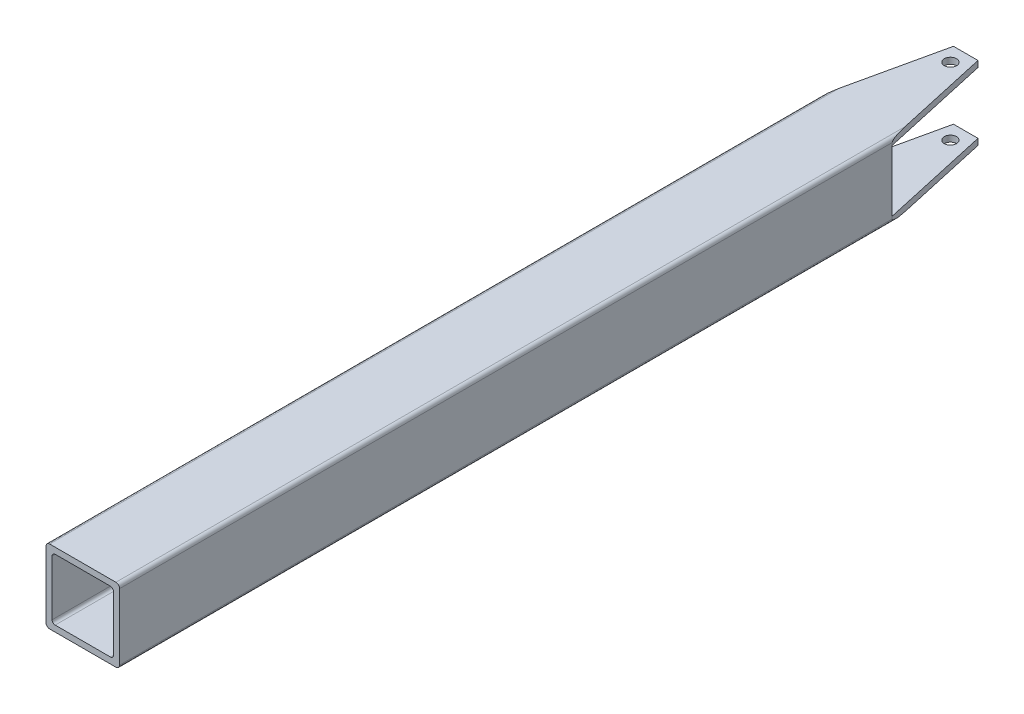
ISO-10303-21;
HEADER;
FILE_DESCRIPTION(('STEP AP214'),'2;1');
FILE_NAME('part.step','',(''),(''),'','','');
FILE_SCHEMA(('AUTOMOTIVE_DESIGN { 1 0 10303 214 1 1 1 1 }'));
ENDSEC;
DATA;
#1=APPLICATION_CONTEXT('core data for automotive mechanical design processes');
#2=APPLICATION_PROTOCOL_DEFINITION('international standard','automotive_design',2000,#1);
#3=PRODUCT_CONTEXT('',#1,'mechanical');
#4=PRODUCT('Part','Part','',(#3));
#5=PRODUCT_RELATED_PRODUCT_CATEGORY('part','',(#4));
#6=PRODUCT_DEFINITION_FORMATION('','',#4);
#7=PRODUCT_DEFINITION_CONTEXT('part definition',#1,'design');
#8=PRODUCT_DEFINITION('design','',#6,#7);
#9=PRODUCT_DEFINITION_SHAPE('','',#8);
#10=(LENGTH_UNIT() NAMED_UNIT(*) SI_UNIT(.MILLI.,.METRE.));
#11=(NAMED_UNIT(*) PLANE_ANGLE_UNIT() SI_UNIT($,.RADIAN.));
#12=(NAMED_UNIT(*) SI_UNIT($,.STERADIAN.) SOLID_ANGLE_UNIT());
#13=UNCERTAINTY_MEASURE_WITH_UNIT(LENGTH_MEASURE(1.E-05),#10,'distance_accuracy_value','');
#14=(GEOMETRIC_REPRESENTATION_CONTEXT(3) GLOBAL_UNCERTAINTY_ASSIGNED_CONTEXT((#13)) GLOBAL_UNIT_ASSIGNED_CONTEXT((#10,
#11,#12)) REPRESENTATION_CONTEXT('',''));
#15=CARTESIAN_POINT('',(0.,0.,0.));
#16=DIRECTION('',(0.,0.,1.));
#17=DIRECTION('',(1.,0.,0.));
#18=AXIS2_PLACEMENT_3D('',#15,#16,#17);
#19=CARTESIAN_POINT('',(34.29,-34.29,-457.2));
#20=DIRECTION('',(0.,0.,1.));
#21=DIRECTION('',(1.,0.,0.));
#22=AXIS2_PLACEMENT_3D('',#19,#20,#21);
#23=PLANE('',#22);
#24=DIRECTION('',(-1.,0.,0.));
#25=VECTOR('',#24,1.);
#26=CARTESIAN_POINT('',(28.575,31.75,-457.2));
#27=LINE('',#26,#25);
#28=CARTESIAN_POINT('',(12.7,31.75,-457.2));
#29=VERTEX_POINT('',#28);
#30=CARTESIAN_POINT('',(-12.7,31.75,-457.2));
#31=VERTEX_POINT('',#30);
#32=EDGE_CURVE('E234',#29,#31,#27,.T.);
#33=ORIENTED_EDGE('',*,*,#32,.T.);
#34=DIRECTION('',(0.,-1.,0.));
#35=VECTOR('',#34,1.);
#36=CARTESIAN_POINT('',(-12.7,38.1,-457.2));
#37=LINE('',#36,#35);
#38=CARTESIAN_POINT('',(-12.7,38.1,-457.2));
#39=VERTEX_POINT('',#38);
#40=EDGE_CURVE('E60',#39,#31,#37,.T.);
#41=ORIENTED_EDGE('',*,*,#40,.F.);
#42=DIRECTION('',(-1.,0.,0.));
#43=VECTOR('',#42,1.);
#44=CARTESIAN_POINT('',(34.29,38.1,-457.2));
#45=LINE('',#44,#43);
#46=CARTESIAN_POINT('',(12.7,38.1,-457.2));
#47=VERTEX_POINT('',#46);
#48=EDGE_CURVE('E232',#47,#39,#45,.T.);
#49=ORIENTED_EDGE('',*,*,#48,.F.);
#50=DIRECTION('',(0.,-1.,0.));
#51=VECTOR('',#50,1.);
#52=CARTESIAN_POINT('',(12.7,38.1,-457.2));
#53=LINE('',#52,#51);
#54=EDGE_CURVE('E405',#47,#29,#53,.T.);
#55=ORIENTED_EDGE('',*,*,#54,.T.);
#56=EDGE_LOOP('',(#33,#41,#49,#55));
#57=FACE_BOUND('',#56,.T.);
#58=ADVANCED_FACE('F40',(#57),#23,.F.);
#59=CARTESIAN_POINT('',(34.29,-34.29,457.2));
#60=DIRECTION('',(0.,0.,1.));
#61=DIRECTION('',(1.,0.,0.));
#62=AXIS2_PLACEMENT_3D('',#59,#60,#61);
#63=PLANE('',#62);
#64=CARTESIAN_POINT('',(34.29,-34.29,457.2));
#65=DIRECTION('',(0.,0.,1.));
#66=DIRECTION('',(1.,0.,0.));
#67=AXIS2_PLACEMENT_3D('',#64,#65,#66);
#68=CIRCLE('',#67,3.81000000000001);
#69=CARTESIAN_POINT('',(34.29,-38.1,457.2));
#70=VERTEX_POINT('',#69);
#71=CARTESIAN_POINT('',(38.1,-34.29,457.2));
#72=VERTEX_POINT('',#71);
#73=EDGE_CURVE('E306',#70,#72,#68,.T.);
#74=ORIENTED_EDGE('',*,*,#73,.T.);
#75=DIRECTION('',(0.,1.,0.));
#76=VECTOR('',#75,1.);
#77=CARTESIAN_POINT('',(38.1,-34.29,457.2));
#78=LINE('',#77,#76);
#79=CARTESIAN_POINT('',(38.1,34.29,457.2));
#80=VERTEX_POINT('',#79);
#81=EDGE_CURVE('E309',#72,#80,#78,.T.);
#82=ORIENTED_EDGE('',*,*,#81,.T.);
#83=CARTESIAN_POINT('',(34.29,34.29,457.2));
#84=DIRECTION('',(0.,0.,1.));
#85=DIRECTION('',(1.,0.,0.));
#86=AXIS2_PLACEMENT_3D('',#83,#84,#85);
#87=CIRCLE('',#86,3.81000000000001);
#88=CARTESIAN_POINT('',(34.29,38.1,457.2));
#89=VERTEX_POINT('',#88);
#90=EDGE_CURVE('E311',#80,#89,#87,.T.);
#91=ORIENTED_EDGE('',*,*,#90,.T.);
#92=DIRECTION('',(-1.,0.,0.));
#93=VECTOR('',#92,1.);
#94=CARTESIAN_POINT('',(34.29,38.1,457.2));
#95=LINE('',#94,#93);
#96=CARTESIAN_POINT('',(-34.29,38.1,457.2));
#97=VERTEX_POINT('',#96);
#98=EDGE_CURVE('E313',#89,#97,#95,.T.);
#99=ORIENTED_EDGE('',*,*,#98,.T.);
#100=CARTESIAN_POINT('',(-34.29,34.29,457.2));
#101=DIRECTION('',(0.,0.,1.));
#102=DIRECTION('',(1.,0.,0.));
#103=AXIS2_PLACEMENT_3D('',#100,#101,#102);
#104=CIRCLE('',#103,3.80999999999999);
#105=CARTESIAN_POINT('',(-38.1,34.29,457.2));
#106=VERTEX_POINT('',#105);
#107=EDGE_CURVE('E315',#97,#106,#104,.T.);
#108=ORIENTED_EDGE('',*,*,#107,.T.);
#109=DIRECTION('',(0.,-1.,0.));
#110=VECTOR('',#109,1.);
#111=CARTESIAN_POINT('',(-38.1,-34.29,457.2));
#112=LINE('',#111,#110);
#113=CARTESIAN_POINT('',(-38.1,-34.29,457.2));
#114=VERTEX_POINT('',#113);
#115=EDGE_CURVE('E317',#106,#114,#112,.T.);
#116=ORIENTED_EDGE('',*,*,#115,.T.);
#117=CARTESIAN_POINT('',(-34.29,-34.29,457.2));
#118=DIRECTION('',(0.,0.,1.));
#119=DIRECTION('',(1.,0.,0.));
#120=AXIS2_PLACEMENT_3D('',#117,#118,#119);
#121=CIRCLE('',#120,3.80999999999999);
#122=CARTESIAN_POINT('',(-34.29,-38.1,457.2));
#123=VERTEX_POINT('',#122);
#124=EDGE_CURVE('E319',#114,#123,#121,.T.);
#125=ORIENTED_EDGE('',*,*,#124,.T.);
#126=DIRECTION('',(1.,0.,0.));
#127=VECTOR('',#126,1.);
#128=CARTESIAN_POINT('',(34.29,-38.1,457.2));
#129=LINE('',#128,#127);
#130=EDGE_CURVE('E321',#123,#70,#129,.T.);
#131=ORIENTED_EDGE('',*,*,#130,.T.);
#132=EDGE_LOOP('',(#74,#82,#91,#99,#108,#116,#125,#131));
#133=FACE_BOUND('',#132,.T.);
#134=DIRECTION('',(-1.,0.,0.));
#135=VECTOR('',#134,1.);
#136=CARTESIAN_POINT('',(28.575,31.75,457.2));
#137=LINE('',#136,#135);
#138=CARTESIAN_POINT('',(28.575,31.75,457.2));
#139=VERTEX_POINT('',#138);
#140=CARTESIAN_POINT('',(-28.575,31.75,457.2));
#141=VERTEX_POINT('',#140);
#142=EDGE_CURVE('E259',#139,#141,#137,.T.);
#143=ORIENTED_EDGE('',*,*,#142,.F.);
#144=CARTESIAN_POINT('',(28.575,28.575,457.2));
#145=DIRECTION('',(0.,0.,1.));
#146=DIRECTION('',(1.,0.,0.));
#147=AXIS2_PLACEMENT_3D('',#144,#145,#146);
#148=CIRCLE('',#147,3.17499999999999);
#149=CARTESIAN_POINT('',(31.75,28.575,457.2));
#150=VERTEX_POINT('',#149);
#151=EDGE_CURVE('E251',#150,#139,#148,.T.);
#152=ORIENTED_EDGE('',*,*,#151,.F.);
#153=DIRECTION('',(0.,1.,0.));
#154=VECTOR('',#153,1.);
#155=CARTESIAN_POINT('',(31.75,28.575,457.2));
#156=LINE('',#155,#154);
#157=CARTESIAN_POINT('',(31.75,-28.575,457.2));
#158=VERTEX_POINT('',#157);
#159=EDGE_CURVE('E272',#158,#150,#156,.T.);
#160=ORIENTED_EDGE('',*,*,#159,.F.);
#161=CARTESIAN_POINT('',(28.575,-28.575,457.2));
#162=DIRECTION('',(0.,0.,1.));
#163=DIRECTION('',(1.,0.,0.));
#164=AXIS2_PLACEMENT_3D('',#161,#162,#163);
#165=CIRCLE('',#164,3.175);
#166=CARTESIAN_POINT('',(28.575,-31.75,457.2));
#167=VERTEX_POINT('',#166);
#168=EDGE_CURVE('E269',#167,#158,#165,.T.);
#169=ORIENTED_EDGE('',*,*,#168,.F.);
#170=DIRECTION('',(1.,0.,0.));
#171=VECTOR('',#170,1.);
#172=CARTESIAN_POINT('',(28.575,-31.75,457.2));
#173=LINE('',#172,#171);
#174=CARTESIAN_POINT('',(-28.575,-31.75,457.2));
#175=VERTEX_POINT('',#174);
#176=EDGE_CURVE('E267',#175,#167,#173,.T.);
#177=ORIENTED_EDGE('',*,*,#176,.F.);
#178=CARTESIAN_POINT('',(-28.575,-28.575,457.2));
#179=DIRECTION('',(0.,0.,1.));
#180=DIRECTION('',(1.,0.,0.));
#181=AXIS2_PLACEMENT_3D('',#178,#179,#180);
#182=CIRCLE('',#181,3.175);
#183=CARTESIAN_POINT('',(-31.75,-28.575,457.2));
#184=VERTEX_POINT('',#183);
#185=EDGE_CURVE('E265',#184,#175,#182,.T.);
#186=ORIENTED_EDGE('',*,*,#185,.F.);
#187=DIRECTION('',(0.,-1.,0.));
#188=VECTOR('',#187,1.);
#189=CARTESIAN_POINT('',(-31.75,28.575,457.2));
#190=LINE('',#189,#188);
#191=CARTESIAN_POINT('',(-31.75,28.575,457.2));
#192=VERTEX_POINT('',#191);
#193=EDGE_CURVE('E263',#192,#184,#190,.T.);
#194=ORIENTED_EDGE('',*,*,#193,.F.);
#195=CARTESIAN_POINT('',(-28.575,28.575,457.2));
#196=DIRECTION('',(0.,0.,1.));
#197=DIRECTION('',(1.,0.,0.));
#198=AXIS2_PLACEMENT_3D('',#195,#196,#197);
#199=CIRCLE('',#198,3.175);
#200=EDGE_CURVE('E261',#141,#192,#199,.T.);
#201=ORIENTED_EDGE('',*,*,#200,.F.);
#202=EDGE_LOOP('',(#143,#152,#160,#169,#177,#186,#194,#201));
#203=FACE_BOUND('',#202,.T.);
#204=ADVANCED_FACE('F471',(#133,#203),#63,.T.);
#205=CARTESIAN_POINT('',(34.29,-34.29,457.2));
#206=DIRECTION('',(0.,0.,-1.));
#207=DIRECTION('',(-1.,0.,0.));
#208=AXIS2_PLACEMENT_3D('',#205,#206,#207);
#209=CYLINDRICAL_SURFACE('',#208,3.81000000000001);
#210=DIRECTION('',(0.,0.,-1.));
#211=VECTOR('',#210,1.);
#212=CARTESIAN_POINT('',(34.29,-38.1,457.2));
#213=LINE('',#212,#211);
#214=CARTESIAN_POINT('',(34.29,-38.1,-360.045));
#215=VERTEX_POINT('',#214);
#216=EDGE_CURVE('E323',#70,#215,#213,.T.);
#217=ORIENTED_EDGE('',*,*,#216,.T.);
#218=CARTESIAN_POINT('',(34.29,-34.29,-360.045));
#219=DIRECTION('',(-0.976187060183953,0.,0.216930457818656));
#220=DIRECTION('',(-0.216930457818656,0.,-0.976187060183953));
#221=AXIS2_PLACEMENT_3D('',#218,#219,#220);
#222=ELLIPSE('',#221,17.563232191143,3.81000000000001);
#223=CARTESIAN_POINT('',(38.1,-34.29,-342.9));
#224=VERTEX_POINT('',#223);
#225=EDGE_CURVE('E362',#215,#224,#222,.T.);
#226=ORIENTED_EDGE('',*,*,#225,.T.);
#227=DIRECTION('',(0.,0.,-1.));
#228=VECTOR('',#227,1.);
#229=CARTESIAN_POINT('',(38.1,-34.29,457.2));
#230=LINE('',#229,#228);
#231=EDGE_CURVE('E50',#72,#224,#230,.T.);
#232=ORIENTED_EDGE('',*,*,#231,.F.);
#233=ORIENTED_EDGE('',*,*,#73,.F.);
#234=EDGE_LOOP('',(#217,#226,#232,#233));
#235=FACE_BOUND('',#234,.T.);
#236=ADVANCED_FACE('F42',(#235),#209,.T.);
#237=CARTESIAN_POINT('',(38.1,-34.29,457.2));
#238=DIRECTION('',(-1.,0.,0.));
#239=DIRECTION('',(0.,0.,1.));
#240=AXIS2_PLACEMENT_3D('',#237,#238,#239);
#241=PLANE('',#240);
#242=ORIENTED_EDGE('',*,*,#231,.T.);
#243=DIRECTION('',(0.,-1.,0.));
#244=VECTOR('',#243,1.);
#245=CARTESIAN_POINT('',(38.1,38.1,-342.9));
#246=LINE('',#245,#244);
#247=CARTESIAN_POINT('',(38.1,-31.75,-342.9));
#248=VERTEX_POINT('',#247);
#249=EDGE_CURVE('E356',#248,#224,#246,.T.);
#250=ORIENTED_EDGE('',*,*,#249,.F.);
#251=DIRECTION('',(0.,1.,0.));
#252=VECTOR('',#251,1.);
#253=CARTESIAN_POINT('',(38.1,31.75,-342.9));
#254=LINE('',#253,#252);
#255=CARTESIAN_POINT('',(38.1,31.75,-342.9));
#256=VERTEX_POINT('',#255);
#257=EDGE_CURVE('E372',#248,#256,#254,.T.);
#258=ORIENTED_EDGE('',*,*,#257,.T.);
#259=CARTESIAN_POINT('',(38.1,34.29,-342.9));
#260=VERTEX_POINT('',#259);
#261=EDGE_CURVE('E418',#260,#256,#246,.T.);
#262=ORIENTED_EDGE('',*,*,#261,.F.);
#263=DIRECTION('',(0.,0.,-1.));
#264=VECTOR('',#263,1.);
#265=CARTESIAN_POINT('',(38.1,34.29,457.2));
#266=LINE('',#265,#264);
#267=EDGE_CURVE('E345',#80,#260,#266,.T.);
#268=ORIENTED_EDGE('',*,*,#267,.F.);
#269=ORIENTED_EDGE('',*,*,#81,.F.);
#270=EDGE_LOOP('',(#242,#250,#258,#262,#268,#269));
#271=FACE_BOUND('',#270,.T.);
#272=ADVANCED_FACE('F354',(#271),#241,.F.);
#273=CARTESIAN_POINT('',(34.29,34.29,457.2));
#274=DIRECTION('',(0.,0.,-1.));
#275=DIRECTION('',(-1.,0.,0.));
#276=AXIS2_PLACEMENT_3D('',#273,#274,#275);
#277=CYLINDRICAL_SURFACE('',#276,3.81000000000001);
#278=ORIENTED_EDGE('',*,*,#267,.T.);
#279=CARTESIAN_POINT('',(34.29,34.29,-360.045));
#280=DIRECTION('',(-0.976187060183953,0.,0.216930457818656));
#281=DIRECTION('',(-0.216930457818656,0.,-0.976187060183953));
#282=AXIS2_PLACEMENT_3D('',#279,#280,#281);
#283=ELLIPSE('',#282,17.563232191143,3.81000000000001);
#284=CARTESIAN_POINT('',(34.29,38.1,-360.045));
#285=VERTEX_POINT('',#284);
#286=EDGE_CURVE('E366',#260,#285,#283,.T.);
#287=ORIENTED_EDGE('',*,*,#286,.T.);
#288=DIRECTION('',(0.,0.,-1.));
#289=VECTOR('',#288,1.);
#290=CARTESIAN_POINT('',(34.29,38.1,457.2));
#291=LINE('',#290,#289);
#292=EDGE_CURVE('E342',#89,#285,#291,.T.);
#293=ORIENTED_EDGE('',*,*,#292,.F.);
#294=ORIENTED_EDGE('',*,*,#90,.F.);
#295=EDGE_LOOP('',(#278,#287,#293,#294));
#296=FACE_BOUND('',#295,.T.);
#297=ADVANCED_FACE('F475',(#296),#277,.T.);
#298=CARTESIAN_POINT('',(34.29,38.1,457.2));
#299=DIRECTION('',(0.,-1.,0.));
#300=DIRECTION('',(0.,0.,-1.));
#301=AXIS2_PLACEMENT_3D('',#298,#299,#300);
#302=PLANE('',#301);
#303=CARTESIAN_POINT('',(0.,38.1,-441.325));
#304=DIRECTION('',(0.,1.,0.));
#305=DIRECTION('',(0.,0.,1.));
#306=AXIS2_PLACEMENT_3D('',#303,#304,#305);
#307=CIRCLE('',#306,6.35);
#308=CARTESIAN_POINT('',(0.,38.1,-434.975));
#309=VERTEX_POINT('',#308);
#310=EDGE_CURVE('E409',#309,#309,#307,.T.);
#311=ORIENTED_EDGE('',*,*,#310,.F.);
#312=EDGE_LOOP('',(#311));
#313=FACE_BOUND('',#312,.T.);
#314=ORIENTED_EDGE('',*,*,#48,.T.);
#315=DIRECTION('',(-0.216930457818656,0.,0.976187060183953));
#316=VECTOR('',#315,1.);
#317=CARTESIAN_POINT('',(-12.7,38.1,-457.2));
#318=LINE('',#317,#316);
#319=CARTESIAN_POINT('',(-34.2899999999999,38.1,-360.045));
#320=VERTEX_POINT('',#319);
#321=EDGE_CURVE('E216',#39,#320,#318,.T.);
#322=ORIENTED_EDGE('',*,*,#321,.T.);
#323=DIRECTION('',(0.,0.,-1.));
#324=VECTOR('',#323,1.);
#325=CARTESIAN_POINT('',(-34.29,38.1,457.2));
#326=LINE('',#325,#324);
#327=EDGE_CURVE('E339',#97,#320,#326,.T.);
#328=ORIENTED_EDGE('',*,*,#327,.F.);
#329=ORIENTED_EDGE('',*,*,#98,.F.);
#330=ORIENTED_EDGE('',*,*,#292,.T.);
#331=DIRECTION('',(-0.216930457818656,0.,-0.976187060183953));
#332=VECTOR('',#331,1.);
#333=CARTESIAN_POINT('',(12.7,38.1,-457.2));
#334=LINE('',#333,#332);
#335=EDGE_CURVE('E242',#285,#47,#334,.T.);
#336=ORIENTED_EDGE('',*,*,#335,.T.);
#337=EDGE_LOOP('',(#314,#322,#328,#329,#330,#336));
#338=FACE_BOUND('',#337,.T.);
#339=ADVANCED_FACE('F240',(#313,#338),#302,.F.);
#340=CARTESIAN_POINT('',(-34.29,34.29,457.2));
#341=DIRECTION('',(0.,0.,-1.));
#342=DIRECTION('',(-1.,0.,0.));
#343=AXIS2_PLACEMENT_3D('',#340,#341,#342);
#344=CYLINDRICAL_SURFACE('',#343,3.80999999999999);
#345=ORIENTED_EDGE('',*,*,#327,.T.);
#346=CARTESIAN_POINT('',(-34.29,34.29,-360.045));
#347=DIRECTION('',(0.976187060183953,0.,0.216930457818656));
#348=DIRECTION('',(0.216930457818656,0.,-0.976187060183953));
#349=AXIS2_PLACEMENT_3D('',#346,#347,#348);
#350=ELLIPSE('',#349,17.5632321911429,3.80999999999999);
#351=CARTESIAN_POINT('',(-38.1,34.29,-342.9));
#352=VERTEX_POINT('',#351);
#353=EDGE_CURVE('E219',#320,#352,#350,.T.);
#354=ORIENTED_EDGE('',*,*,#353,.T.);
#355=DIRECTION('',(0.,0.,-1.));
#356=VECTOR('',#355,1.);
#357=CARTESIAN_POINT('',(-38.1,34.29,457.2));
#358=LINE('',#357,#356);
#359=EDGE_CURVE('E335',#106,#352,#358,.T.);
#360=ORIENTED_EDGE('',*,*,#359,.F.);
#361=ORIENTED_EDGE('',*,*,#107,.F.);
#362=EDGE_LOOP('',(#345,#354,#360,#361));
#363=FACE_BOUND('',#362,.T.);
#364=ADVANCED_FACE('F467',(#363),#344,.T.);
#365=CARTESIAN_POINT('',(-38.1,-34.29,457.2));
#366=DIRECTION('',(1.,0.,0.));
#367=DIRECTION('',(0.,0.,-1.));
#368=AXIS2_PLACEMENT_3D('',#365,#366,#367);
#369=PLANE('',#368);
#370=ORIENTED_EDGE('',*,*,#359,.T.);
#371=DIRECTION('',(0.,-1.,0.));
#372=VECTOR('',#371,1.);
#373=CARTESIAN_POINT('',(-38.1,38.1,-342.9));
#374=LINE('',#373,#372);
#375=CARTESIAN_POINT('',(-38.1,31.75,-342.9));
#376=VERTEX_POINT('',#375);
#377=EDGE_CURVE('E422',#352,#376,#374,.T.);
#378=ORIENTED_EDGE('',*,*,#377,.T.);
#379=DIRECTION('',(0.,1.,0.));
#380=VECTOR('',#379,1.);
#381=CARTESIAN_POINT('',(-38.1,31.75,-342.9));
#382=LINE('',#381,#380);
#383=CARTESIAN_POINT('',(-38.1,-31.75,-342.9));
#384=VERTEX_POINT('',#383);
#385=EDGE_CURVE('E365',#384,#376,#382,.T.);
#386=ORIENTED_EDGE('',*,*,#385,.F.);
#387=CARTESIAN_POINT('',(-38.1,-34.29,-342.9));
#388=VERTEX_POINT('',#387);
#389=EDGE_CURVE('E225',#384,#388,#374,.T.);
#390=ORIENTED_EDGE('',*,*,#389,.T.);
#391=DIRECTION('',(0.,0.,-1.));
#392=VECTOR('',#391,1.);
#393=CARTESIAN_POINT('',(-38.1,-34.29,457.2));
#394=LINE('',#393,#392);
#395=EDGE_CURVE('E331',#114,#388,#394,.T.);
#396=ORIENTED_EDGE('',*,*,#395,.F.);
#397=ORIENTED_EDGE('',*,*,#115,.F.);
#398=EDGE_LOOP('',(#370,#378,#386,#390,#396,#397));
#399=FACE_BOUND('',#398,.T.);
#400=ADVANCED_FACE('F462',(#399),#369,.F.);
#401=CARTESIAN_POINT('',(-34.29,-34.29,457.2));
#402=DIRECTION('',(0.,0.,-1.));
#403=DIRECTION('',(-1.,0.,0.));
#404=AXIS2_PLACEMENT_3D('',#401,#402,#403);
#405=CYLINDRICAL_SURFACE('',#404,3.80999999999999);
#406=ORIENTED_EDGE('',*,*,#395,.T.);
#407=CARTESIAN_POINT('',(-34.29,-34.29,-360.045));
#408=DIRECTION('',(0.976187060183953,0.,0.216930457818656));
#409=DIRECTION('',(0.216930457818656,0.,-0.976187060183953));
#410=AXIS2_PLACEMENT_3D('',#407,#408,#409);
#411=ELLIPSE('',#410,17.5632321911429,3.80999999999999);
#412=CARTESIAN_POINT('',(-34.2900000000001,-38.1,-360.045));
#413=VERTEX_POINT('',#412);
#414=EDGE_CURVE('E425',#388,#413,#411,.T.);
#415=ORIENTED_EDGE('',*,*,#414,.T.);
#416=DIRECTION('',(0.,0.,-1.));
#417=VECTOR('',#416,1.);
#418=CARTESIAN_POINT('',(-34.29,-38.1,457.2));
#419=LINE('',#418,#417);
#420=EDGE_CURVE('E327',#123,#413,#419,.T.);
#421=ORIENTED_EDGE('',*,*,#420,.F.);
#422=ORIENTED_EDGE('',*,*,#124,.F.);
#423=EDGE_LOOP('',(#406,#415,#421,#422));
#424=FACE_BOUND('',#423,.T.);
#425=ADVANCED_FACE('F565',(#424),#405,.T.);
#426=CARTESIAN_POINT('',(34.29,-38.1,457.2));
#427=DIRECTION('',(0.,1.,0.));
#428=DIRECTION('',(0.,0.,1.));
#429=AXIS2_PLACEMENT_3D('',#426,#427,#428);
#430=PLANE('',#429);
#431=CARTESIAN_POINT('',(0.,-38.1,-441.325));
#432=DIRECTION('',(0.,1.,0.));
#433=DIRECTION('',(0.,0.,1.));
#434=AXIS2_PLACEMENT_3D('',#431,#432,#433);
#435=CIRCLE('',#434,6.35);
#436=CARTESIAN_POINT('',(0.,-38.1,-434.975));
#437=VERTEX_POINT('',#436);
#438=EDGE_CURVE('E412',#437,#437,#435,.T.);
#439=ORIENTED_EDGE('',*,*,#438,.T.);
#440=EDGE_LOOP('',(#439));
#441=FACE_BOUND('',#440,.T.);
#442=ORIENTED_EDGE('',*,*,#420,.T.);
#443=DIRECTION('',(-0.216930457818656,0.,0.976187060183953));
#444=VECTOR('',#443,1.);
#445=CARTESIAN_POINT('',(-12.7,-38.1,-457.2));
#446=LINE('',#445,#444);
#447=CARTESIAN_POINT('',(-12.7,-38.1,-457.2));
#448=VERTEX_POINT('',#447);
#449=EDGE_CURVE('E226',#448,#413,#446,.T.);
#450=ORIENTED_EDGE('',*,*,#449,.F.);
#451=DIRECTION('',(1.,0.,0.));
#452=VECTOR('',#451,1.);
#453=CARTESIAN_POINT('',(34.29,-38.1,-457.2));
#454=LINE('',#453,#452);
#455=CARTESIAN_POINT('',(12.7,-38.1,-457.2));
#456=VERTEX_POINT('',#455);
#457=EDGE_CURVE('E244',#448,#456,#454,.T.);
#458=ORIENTED_EDGE('',*,*,#457,.T.);
#459=DIRECTION('',(-0.216930457818656,0.,-0.976187060183953));
#460=VECTOR('',#459,1.);
#461=CARTESIAN_POINT('',(12.7,-38.1,-457.2));
#462=LINE('',#461,#460);
#463=EDGE_CURVE('E69',#215,#456,#462,.T.);
#464=ORIENTED_EDGE('',*,*,#463,.F.);
#465=ORIENTED_EDGE('',*,*,#216,.F.);
#466=ORIENTED_EDGE('',*,*,#130,.F.);
#467=EDGE_LOOP('',(#442,#450,#458,#464,#465,#466));
#468=FACE_BOUND('',#467,.T.);
#469=ADVANCED_FACE('F568',(#441,#468),#430,.F.);
#470=CARTESIAN_POINT('',(28.575,28.575,457.2));
#471=DIRECTION('',(0.,0.,-1.));
#472=DIRECTION('',(-1.,0.,0.));
#473=AXIS2_PLACEMENT_3D('',#470,#471,#472);
#474=CYLINDRICAL_SURFACE('',#473,3.17499999999999);
#475=CARTESIAN_POINT('',(28.575,28.575,-342.9));
#476=DIRECTION('',(0.,0.,1.));
#477=DIRECTION('',(1.,0.,0.));
#478=AXIS2_PLACEMENT_3D('',#475,#476,#477);
#479=CIRCLE('',#478,3.17499999999999);
#480=CARTESIAN_POINT('',(31.75,28.575,-342.9));
#481=VERTEX_POINT('',#480);
#482=CARTESIAN_POINT('',(28.575,31.75,-342.9));
#483=VERTEX_POINT('',#482);
#484=EDGE_CURVE('E394',#481,#483,#479,.T.);
#485=ORIENTED_EDGE('',*,*,#484,.F.);
#486=DIRECTION('',(0.,0.,-1.));
#487=VECTOR('',#486,1.);
#488=CARTESIAN_POINT('',(31.75,28.575,457.2));
#489=LINE('',#488,#487);
#490=EDGE_CURVE('E274',#150,#481,#489,.T.);
#491=ORIENTED_EDGE('',*,*,#490,.F.);
#492=ORIENTED_EDGE('',*,*,#151,.T.);
#493=DIRECTION('',(0.,0.,-1.));
#494=VECTOR('',#493,1.);
#495=CARTESIAN_POINT('',(28.575,31.75,457.2));
#496=LINE('',#495,#494);
#497=EDGE_CURVE('E302',#139,#483,#496,.T.);
#498=ORIENTED_EDGE('',*,*,#497,.T.);
#499=EDGE_LOOP('',(#485,#491,#492,#498));
#500=FACE_BOUND('',#499,.T.);
#501=ADVANCED_FACE('F485',(#500),#474,.F.);
#502=CARTESIAN_POINT('',(28.575,31.75,457.2));
#503=DIRECTION('',(0.,-1.,0.));
#504=DIRECTION('',(1.,0.,0.));
#505=AXIS2_PLACEMENT_3D('',#502,#503,#504);
#506=PLANE('',#505);
#507=CARTESIAN_POINT('',(0.,31.75,-441.325));
#508=DIRECTION('',(0.,-1.,0.));
#509=DIRECTION('',(1.,0.,0.));
#510=AXIS2_PLACEMENT_3D('',#507,#508,#509);
#511=CIRCLE('',#510,6.35);
#512=CARTESIAN_POINT('',(6.35,31.75,-441.325));
#513=VERTEX_POINT('',#512);
#514=EDGE_CURVE('E414',#513,#513,#511,.T.);
#515=ORIENTED_EDGE('',*,*,#514,.F.);
#516=EDGE_LOOP('',(#515));
#517=FACE_BOUND('',#516,.T.);
#518=DIRECTION('',(-0.216930457818656,0.,0.976187060183953));
#519=VECTOR('',#518,1.);
#520=CARTESIAN_POINT('',(-204.395294117647,31.75,405.428823529412));
#521=LINE('',#520,#519);
#522=EDGE_CURVE('E424',#31,#376,#521,.T.);
#523=ORIENTED_EDGE('',*,*,#522,.F.);
#524=ORIENTED_EDGE('',*,*,#32,.F.);
#525=DIRECTION('',(-0.216930457818656,0.,-0.976187060183953));
#526=VECTOR('',#525,1.);
#527=CARTESIAN_POINT('',(207.084705882353,31.75,417.531176470588));
#528=LINE('',#527,#526);
#529=EDGE_CURVE('E376',#256,#29,#528,.T.);
#530=ORIENTED_EDGE('',*,*,#529,.F.);
#531=DIRECTION('',(-1.,0.,0.));
#532=VECTOR('',#531,1.);
#533=CARTESIAN_POINT('',(38.1,31.75,-342.9));
#534=LINE('',#533,#532);
#535=EDGE_CURVE('E383',#256,#483,#534,.T.);
#536=ORIENTED_EDGE('',*,*,#535,.T.);
#537=ORIENTED_EDGE('',*,*,#497,.F.);
#538=ORIENTED_EDGE('',*,*,#142,.T.);
#539=DIRECTION('',(0.,0.,-1.));
#540=VECTOR('',#539,1.);
#541=CARTESIAN_POINT('',(-28.575,31.75,457.2));
#542=LINE('',#541,#540);
#543=CARTESIAN_POINT('',(-28.575,31.75,-342.9));
#544=VERTEX_POINT('',#543);
#545=EDGE_CURVE('E298',#141,#544,#542,.T.);
#546=ORIENTED_EDGE('',*,*,#545,.T.);
#547=EDGE_CURVE('E388',#544,#376,#534,.T.);
#548=ORIENTED_EDGE('',*,*,#547,.T.);
#549=EDGE_LOOP('',(#523,#524,#530,#536,#537,#538,#546,#548));
#550=FACE_BOUND('',#549,.T.);
#551=ADVANCED_FACE('F460',(#517,#550),#506,.T.);
#552=CARTESIAN_POINT('',(-28.575,28.575,457.2));
#553=DIRECTION('',(0.,0.,-1.));
#554=DIRECTION('',(-1.,0.,0.));
#555=AXIS2_PLACEMENT_3D('',#552,#553,#554);
#556=CYLINDRICAL_SURFACE('',#555,3.175);
#557=CARTESIAN_POINT('',(-28.575,28.575,-342.9));
#558=DIRECTION('',(0.,0.,1.));
#559=DIRECTION('',(1.,0.,0.));
#560=AXIS2_PLACEMENT_3D('',#557,#558,#559);
#561=CIRCLE('',#560,3.175);
#562=CARTESIAN_POINT('',(-31.75,28.575,-342.9));
#563=VERTEX_POINT('',#562);
#564=EDGE_CURVE('E402',#544,#563,#561,.T.);
#565=ORIENTED_EDGE('',*,*,#564,.F.);
#566=ORIENTED_EDGE('',*,*,#545,.F.);
#567=ORIENTED_EDGE('',*,*,#200,.T.);
#568=DIRECTION('',(0.,0.,-1.));
#569=VECTOR('',#568,1.);
#570=CARTESIAN_POINT('',(-31.75,28.575,457.2));
#571=LINE('',#570,#569);
#572=EDGE_CURVE('E294',#192,#563,#571,.T.);
#573=ORIENTED_EDGE('',*,*,#572,.T.);
#574=EDGE_LOOP('',(#565,#566,#567,#573));
#575=FACE_BOUND('',#574,.T.);
#576=ADVANCED_FACE('F495',(#575),#556,.F.);
#577=CARTESIAN_POINT('',(-31.75,28.575,457.2));
#578=DIRECTION('',(1.,0.,0.));
#579=DIRECTION('',(0.,0.,-1.));
#580=AXIS2_PLACEMENT_3D('',#577,#578,#579);
#581=PLANE('',#580);
#582=DIRECTION('',(0.,-1.,0.));
#583=VECTOR('',#582,1.);
#584=CARTESIAN_POINT('',(-31.75,28.575,-342.9));
#585=LINE('',#584,#583);
#586=CARTESIAN_POINT('',(-31.75,-28.575,-342.9));
#587=VERTEX_POINT('',#586);
#588=EDGE_CURVE('E399',#563,#587,#585,.T.);
#589=ORIENTED_EDGE('',*,*,#588,.F.);
#590=ORIENTED_EDGE('',*,*,#572,.F.);
#591=ORIENTED_EDGE('',*,*,#193,.T.);
#592=DIRECTION('',(0.,0.,-1.));
#593=VECTOR('',#592,1.);
#594=CARTESIAN_POINT('',(-31.75,-28.575,457.2));
#595=LINE('',#594,#593);
#596=EDGE_CURVE('E290',#184,#587,#595,.T.);
#597=ORIENTED_EDGE('',*,*,#596,.T.);
#598=EDGE_LOOP('',(#589,#590,#591,#597));
#599=FACE_BOUND('',#598,.T.);
#600=ADVANCED_FACE('F502',(#599),#581,.T.);
#601=CARTESIAN_POINT('',(-28.575,-28.575,457.2));
#602=DIRECTION('',(0.,0.,-1.));
#603=DIRECTION('',(-1.,0.,0.));
#604=AXIS2_PLACEMENT_3D('',#601,#602,#603);
#605=CYLINDRICAL_SURFACE('',#604,3.175);
#606=CARTESIAN_POINT('',(-28.575,-28.575,-342.9));
#607=DIRECTION('',(0.,0.,1.));
#608=DIRECTION('',(1.,0.,0.));
#609=AXIS2_PLACEMENT_3D('',#606,#607,#608);
#610=CIRCLE('',#609,3.175);
#611=CARTESIAN_POINT('',(-28.575,-31.75,-342.9));
#612=VERTEX_POINT('',#611);
#613=EDGE_CURVE('E396',#587,#612,#610,.T.);
#614=ORIENTED_EDGE('',*,*,#613,.F.);
#615=ORIENTED_EDGE('',*,*,#596,.F.);
#616=ORIENTED_EDGE('',*,*,#185,.T.);
#617=DIRECTION('',(0.,0.,-1.));
#618=VECTOR('',#617,1.);
#619=CARTESIAN_POINT('',(-28.575,-31.75,457.2));
#620=LINE('',#619,#618);
#621=EDGE_CURVE('E286',#175,#612,#620,.T.);
#622=ORIENTED_EDGE('',*,*,#621,.T.);
#623=EDGE_LOOP('',(#614,#615,#616,#622));
#624=FACE_BOUND('',#623,.T.);
#625=ADVANCED_FACE('F506',(#624),#605,.F.);
#626=CARTESIAN_POINT('',(28.575,-31.75,457.2));
#627=DIRECTION('',(0.,1.,0.));
#628=DIRECTION('',(-1.,0.,0.));
#629=AXIS2_PLACEMENT_3D('',#626,#627,#628);
#630=PLANE('',#629);
#631=CARTESIAN_POINT('',(0.,-31.75,-441.325));
#632=DIRECTION('',(0.,1.,0.));
#633=DIRECTION('',(-1.,0.,0.));
#634=AXIS2_PLACEMENT_3D('',#631,#632,#633);
#635=CIRCLE('',#634,6.35);
#636=CARTESIAN_POINT('',(-6.34999999999999,-31.75,-441.325));
#637=VERTEX_POINT('',#636);
#638=EDGE_CURVE('E44',#637,#637,#635,.T.);
#639=ORIENTED_EDGE('',*,*,#638,.F.);
#640=EDGE_LOOP('',(#639));
#641=FACE_BOUND('',#640,.T.);
#642=DIRECTION('',(0.216930457818656,0.,-0.976187060183953));
#643=VECTOR('',#642,1.);
#644=CARTESIAN_POINT('',(-204.395294117647,-31.75,405.428823529412));
#645=LINE('',#644,#643);
#646=CARTESIAN_POINT('',(-12.7,-31.75,-457.2));
#647=VERTEX_POINT('',#646);
#648=EDGE_CURVE('E236',#384,#647,#645,.T.);
#649=ORIENTED_EDGE('',*,*,#648,.F.);
#650=DIRECTION('',(-1.,0.,0.));
#651=VECTOR('',#650,1.);
#652=CARTESIAN_POINT('',(38.1,-31.75,-342.9));
#653=LINE('',#652,#651);
#654=EDGE_CURVE('E381',#612,#384,#653,.T.);
#655=ORIENTED_EDGE('',*,*,#654,.F.);
#656=ORIENTED_EDGE('',*,*,#621,.F.);
#657=ORIENTED_EDGE('',*,*,#176,.T.);
#658=DIRECTION('',(0.,0.,-1.));
#659=VECTOR('',#658,1.);
#660=CARTESIAN_POINT('',(28.575,-31.75,457.2));
#661=LINE('',#660,#659);
#662=CARTESIAN_POINT('',(28.575,-31.75,-342.9));
#663=VERTEX_POINT('',#662);
#664=EDGE_CURVE('E282',#167,#663,#661,.T.);
#665=ORIENTED_EDGE('',*,*,#664,.T.);
#666=EDGE_CURVE('E389',#248,#663,#653,.T.);
#667=ORIENTED_EDGE('',*,*,#666,.F.);
#668=DIRECTION('',(0.216930457818656,0.,0.976187060183953));
#669=VECTOR('',#668,1.);
#670=CARTESIAN_POINT('',(207.084705882353,-31.75,417.531176470588));
#671=LINE('',#670,#669);
#672=CARTESIAN_POINT('',(12.7,-31.75,-457.2));
#673=VERTEX_POINT('',#672);
#674=EDGE_CURVE('E451',#673,#248,#671,.T.);
#675=ORIENTED_EDGE('',*,*,#674,.F.);
#676=DIRECTION('',(1.,0.,0.));
#677=VECTOR('',#676,1.);
#678=CARTESIAN_POINT('',(28.575,-31.75,-457.2));
#679=LINE('',#678,#677);
#680=EDGE_CURVE('E245',#647,#673,#679,.T.);
#681=ORIENTED_EDGE('',*,*,#680,.F.);
#682=EDGE_LOOP('',(#649,#655,#656,#657,#665,#667,#675,#681));
#683=FACE_BOUND('',#682,.T.);
#684=ADVANCED_FACE('F512',(#641,#683),#630,.T.);
#685=CARTESIAN_POINT('',(28.575,-28.575,457.2));
#686=DIRECTION('',(0.,0.,-1.));
#687=DIRECTION('',(-1.,0.,0.));
#688=AXIS2_PLACEMENT_3D('',#685,#686,#687);
#689=CYLINDRICAL_SURFACE('',#688,3.175);
#690=CARTESIAN_POINT('',(28.575,-28.575,-342.9));
#691=DIRECTION('',(0.,0.,1.));
#692=DIRECTION('',(1.,0.,0.));
#693=AXIS2_PLACEMENT_3D('',#690,#691,#692);
#694=CIRCLE('',#693,3.175);
#695=CARTESIAN_POINT('',(31.75,-28.575,-342.9));
#696=VERTEX_POINT('',#695);
#697=EDGE_CURVE('E387',#663,#696,#694,.T.);
#698=ORIENTED_EDGE('',*,*,#697,.F.);
#699=ORIENTED_EDGE('',*,*,#664,.F.);
#700=ORIENTED_EDGE('',*,*,#168,.T.);
#701=DIRECTION('',(0.,0.,-1.));
#702=VECTOR('',#701,1.);
#703=CARTESIAN_POINT('',(31.75,-28.575,457.2));
#704=LINE('',#703,#702);
#705=EDGE_CURVE('E278',#158,#696,#704,.T.);
#706=ORIENTED_EDGE('',*,*,#705,.T.);
#707=EDGE_LOOP('',(#698,#699,#700,#706));
#708=FACE_BOUND('',#707,.T.);
#709=ADVANCED_FACE('F515',(#708),#689,.F.);
#710=CARTESIAN_POINT('',(31.75,28.575,457.2));
#711=DIRECTION('',(-1.,0.,0.));
#712=DIRECTION('',(0.,-1.,0.));
#713=AXIS2_PLACEMENT_3D('',#710,#711,#712);
#714=PLANE('',#713);
#715=DIRECTION('',(0.,1.,0.));
#716=VECTOR('',#715,1.);
#717=CARTESIAN_POINT('',(31.75,28.575,-342.9));
#718=LINE('',#717,#716);
#719=EDGE_CURVE('E11',#696,#481,#718,.T.);
#720=ORIENTED_EDGE('',*,*,#719,.F.);
#721=ORIENTED_EDGE('',*,*,#705,.F.);
#722=ORIENTED_EDGE('',*,*,#159,.T.);
#723=ORIENTED_EDGE('',*,*,#490,.T.);
#724=EDGE_LOOP('',(#720,#721,#722,#723));
#725=FACE_BOUND('',#724,.T.);
#726=ADVANCED_FACE('F518',(#725),#714,.T.);
#727=ORIENTED_EDGE('',*,*,#457,.F.);
#728=EDGE_CURVE('E237',#647,#448,#37,.T.);
#729=ORIENTED_EDGE('',*,*,#728,.F.);
#730=ORIENTED_EDGE('',*,*,#680,.T.);
#731=EDGE_CURVE('E407',#673,#456,#53,.T.);
#732=ORIENTED_EDGE('',*,*,#731,.T.);
#733=EDGE_LOOP('',(#727,#729,#730,#732));
#734=FACE_BOUND('',#733,.T.);
#735=ADVANCED_FACE('F520',(#734),#23,.F.);
#736=CARTESIAN_POINT('',(38.1,31.75,-342.9));
#737=DIRECTION('',(0.,0.,1.));
#738=DIRECTION('',(1.,0.,0.));
#739=AXIS2_PLACEMENT_3D('',#736,#737,#738);
#740=PLANE('',#739);
#741=ORIENTED_EDGE('',*,*,#484,.T.);
#742=ORIENTED_EDGE('',*,*,#535,.F.);
#743=ORIENTED_EDGE('',*,*,#257,.F.);
#744=ORIENTED_EDGE('',*,*,#666,.T.);
#745=ORIENTED_EDGE('',*,*,#697,.T.);
#746=ORIENTED_EDGE('',*,*,#719,.T.);
#747=EDGE_LOOP('',(#741,#742,#743,#744,#745,#746));
#748=FACE_BOUND('',#747,.T.);
#749=ADVANCED_FACE('F479',(#748),#740,.F.);
#750=ORIENTED_EDGE('',*,*,#564,.T.);
#751=ORIENTED_EDGE('',*,*,#588,.T.);
#752=ORIENTED_EDGE('',*,*,#613,.T.);
#753=ORIENTED_EDGE('',*,*,#654,.T.);
#754=ORIENTED_EDGE('',*,*,#385,.T.);
#755=ORIENTED_EDGE('',*,*,#547,.F.);
#756=EDGE_LOOP('',(#750,#751,#752,#753,#754,#755));
#757=FACE_BOUND('',#756,.T.);
#758=ADVANCED_FACE('F499',(#757),#740,.F.);
#759=CARTESIAN_POINT('',(12.7,38.1,-457.2));
#760=DIRECTION('',(-0.976187060183953,0.,0.216930457818656));
#761=DIRECTION('',(0.216930457818656,0.,0.976187060183953));
#762=AXIS2_PLACEMENT_3D('',#759,#760,#761);
#763=PLANE('',#762);
#764=ORIENTED_EDGE('',*,*,#463,.T.);
#765=ORIENTED_EDGE('',*,*,#731,.F.);
#766=ORIENTED_EDGE('',*,*,#674,.T.);
#767=ORIENTED_EDGE('',*,*,#249,.T.);
#768=ORIENTED_EDGE('',*,*,#225,.F.);
#769=EDGE_LOOP('',(#764,#765,#766,#767,#768));
#770=FACE_BOUND('',#769,.T.);
#771=ADVANCED_FACE('F537',(#770),#763,.F.);
#772=CARTESIAN_POINT('',(-12.7,38.1,-457.2));
#773=DIRECTION('',(0.976187060183953,0.,0.216930457818656));
#774=DIRECTION('',(0.216930457818656,0.,-0.976187060183953));
#775=AXIS2_PLACEMENT_3D('',#772,#773,#774);
#776=PLANE('',#775);
#777=ORIENTED_EDGE('',*,*,#389,.F.);
#778=ORIENTED_EDGE('',*,*,#648,.T.);
#779=ORIENTED_EDGE('',*,*,#728,.T.);
#780=ORIENTED_EDGE('',*,*,#449,.T.);
#781=ORIENTED_EDGE('',*,*,#414,.F.);
#782=EDGE_LOOP('',(#777,#778,#779,#780,#781));
#783=FACE_BOUND('',#782,.T.);
#784=ADVANCED_FACE('F540',(#783),#776,.F.);
#785=ORIENTED_EDGE('',*,*,#261,.T.);
#786=ORIENTED_EDGE('',*,*,#529,.T.);
#787=ORIENTED_EDGE('',*,*,#54,.F.);
#788=ORIENTED_EDGE('',*,*,#335,.F.);
#789=ORIENTED_EDGE('',*,*,#286,.F.);
#790=EDGE_LOOP('',(#785,#786,#787,#788,#789));
#791=FACE_BOUND('',#790,.T.);
#792=ADVANCED_FACE('F456',(#791),#763,.F.);
#793=ORIENTED_EDGE('',*,*,#321,.F.);
#794=ORIENTED_EDGE('',*,*,#40,.T.);
#795=ORIENTED_EDGE('',*,*,#522,.T.);
#796=ORIENTED_EDGE('',*,*,#377,.F.);
#797=ORIENTED_EDGE('',*,*,#353,.F.);
#798=EDGE_LOOP('',(#793,#794,#795,#796,#797));
#799=FACE_BOUND('',#798,.T.);
#800=ADVANCED_FACE('F217',(#799),#776,.F.);
#801=CARTESIAN_POINT('',(0.,-38.1,-441.325));
#802=DIRECTION('',(0.,1.,0.));
#803=DIRECTION('',(0.,0.,1.));
#804=AXIS2_PLACEMENT_3D('',#801,#802,#803);
#805=CYLINDRICAL_SURFACE('',#804,6.35);
#806=ORIENTED_EDGE('',*,*,#638,.T.);
#807=EDGE_LOOP('',(#806));
#808=FACE_BOUND('',#807,.T.);
#809=ORIENTED_EDGE('',*,*,#438,.F.);
#810=EDGE_LOOP('',(#809));
#811=FACE_BOUND('',#810,.T.);
#812=ADVANCED_FACE('F543',(#808,#811),#805,.F.);
#813=ORIENTED_EDGE('',*,*,#514,.T.);
#814=EDGE_LOOP('',(#813));
#815=FACE_BOUND('',#814,.T.);
#816=ORIENTED_EDGE('',*,*,#310,.T.);
#817=EDGE_LOOP('',(#816));
#818=FACE_BOUND('',#817,.T.);
#819=ADVANCED_FACE('F545',(#815,#818),#805,.F.);
#820=CLOSED_SHELL('',(#58,#204,#236,#272,#297,#339,#364,#400,#425,#469,#501,#551,#576,#600,#625,
#684,#709,#726,#735,#749,#758,#771,#784,#792,#800,#812,#819));
#821=MANIFOLD_SOLID_BREP('B2',#820);
#822=ADVANCED_BREP_SHAPE_REPRESENTATION('',(#18,#821),#14);
#823=SHAPE_DEFINITION_REPRESENTATION(#9,#822);
ENDSEC;
END-ISO-10303-21;
